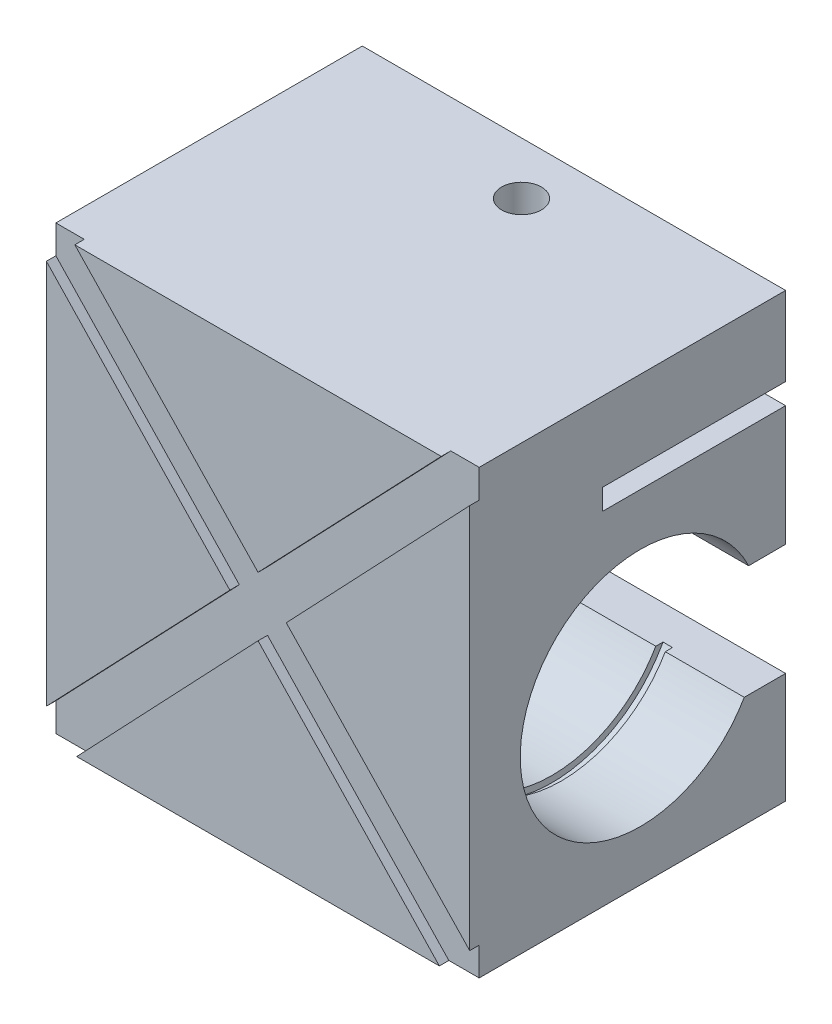
ISO-10303-21;
HEADER;
FILE_DESCRIPTION(('STEP AP214'),'2;1');
FILE_NAME('part.step','',(''),(''),'','','');
FILE_SCHEMA(('AUTOMOTIVE_DESIGN { 1 0 10303 214 1 1 1 1 }'));
ENDSEC;
DATA;
#1=APPLICATION_CONTEXT('core data for automotive mechanical design processes');
#2=APPLICATION_PROTOCOL_DEFINITION('international standard','automotive_design',2000,#1);
#3=PRODUCT_CONTEXT('',#1,'mechanical');
#4=PRODUCT('Part','Part','',(#3));
#5=PRODUCT_RELATED_PRODUCT_CATEGORY('part','',(#4));
#6=PRODUCT_DEFINITION_FORMATION('','',#4);
#7=PRODUCT_DEFINITION_CONTEXT('part definition',#1,'design');
#8=PRODUCT_DEFINITION('design','',#6,#7);
#9=PRODUCT_DEFINITION_SHAPE('','',#8);
#10=(LENGTH_UNIT() NAMED_UNIT(*) SI_UNIT(.MILLI.,.METRE.));
#11=(NAMED_UNIT(*) PLANE_ANGLE_UNIT() SI_UNIT($,.RADIAN.));
#12=(NAMED_UNIT(*) SI_UNIT($,.STERADIAN.) SOLID_ANGLE_UNIT());
#13=UNCERTAINTY_MEASURE_WITH_UNIT(LENGTH_MEASURE(1.E-05),#10,'distance_accuracy_value','');
#14=(GEOMETRIC_REPRESENTATION_CONTEXT(3) GLOBAL_UNCERTAINTY_ASSIGNED_CONTEXT((#13)) GLOBAL_UNIT_ASSIGNED_CONTEXT((#10,
#11,#12)) REPRESENTATION_CONTEXT('',''));
#15=CARTESIAN_POINT('',(0.,0.,0.));
#16=DIRECTION('',(0.,0.,1.));
#17=DIRECTION('',(1.,0.,0.));
#18=AXIS2_PLACEMENT_3D('',#15,#16,#17);
#19=CARTESIAN_POINT('',(-33.5,-17.5000000000001,-50.));
#20=DIRECTION('',(0.,-1.,0.));
#21=DIRECTION('',(1.,0.,0.));
#22=AXIS2_PLACEMENT_3D('',#19,#20,#21);
#23=PLANE('',#22);
#24=DIRECTION('',(0.,0.,1.));
#25=VECTOR('',#24,1.);
#26=CARTESIAN_POINT('',(-24.,-17.5000000000001,-50.));
#27=LINE('',#26,#25);
#28=CARTESIAN_POINT('',(-24.,-17.5000000000001,-44.5997159067981));
#29=VERTEX_POINT('',#28);
#30=CARTESIAN_POINT('',(-24.,-17.5000000000001,-43.4544826719043));
#31=VERTEX_POINT('',#30);
#32=EDGE_CURVE('E286',#29,#31,#27,.T.);
#33=ORIENTED_EDGE('',*,*,#32,.F.);
#34=DIRECTION('',(1.,0.,0.));
#35=VECTOR('',#34,1.);
#36=CARTESIAN_POINT('',(-24.,-17.5000000000001,-44.5997159067981));
#37=LINE('',#36,#35);
#38=CARTESIAN_POINT('',(-22.5,-17.5000000000001,-44.5997159067981));
#39=VERTEX_POINT('',#38);
#40=EDGE_CURVE('E277',#29,#39,#37,.T.);
#41=ORIENTED_EDGE('',*,*,#40,.T.);
#42=DIRECTION('',(0.,0.,1.));
#43=VECTOR('',#42,1.);
#44=CARTESIAN_POINT('',(-22.5,-17.5000000000001,-50.));
#45=LINE('',#44,#43);
#46=CARTESIAN_POINT('',(-22.5,-17.5000000000001,-43.4544826719043));
#47=VERTEX_POINT('',#46);
#48=EDGE_CURVE('E264',#39,#47,#45,.T.);
#49=ORIENTED_EDGE('',*,*,#48,.T.);
#50=DIRECTION('',(1.,0.,0.));
#51=VECTOR('',#50,1.);
#52=CARTESIAN_POINT('',(-33.5,-17.5000000000001,-43.4544826719043));
#53=LINE('',#52,#51);
#54=CARTESIAN_POINT('',(19.5,-17.5,-43.4544826719043));
#55=VERTEX_POINT('',#54);
#56=EDGE_CURVE('E371',#47,#55,#53,.T.);
#57=ORIENTED_EDGE('',*,*,#56,.T.);
#58=DIRECTION('',(0.,0.,1.));
#59=VECTOR('',#58,1.);
#60=CARTESIAN_POINT('',(19.5,-17.4999999999999,-50.));
#61=LINE('',#60,#59);
#62=CARTESIAN_POINT('',(19.5,-17.4999999999999,-44.5997159067981));
#63=VERTEX_POINT('',#62);
#64=EDGE_CURVE('E311',#63,#55,#61,.T.);
#65=ORIENTED_EDGE('',*,*,#64,.F.);
#66=DIRECTION('',(1.,0.,0.));
#67=VECTOR('',#66,1.);
#68=CARTESIAN_POINT('',(19.5,-17.4999999999999,-44.5997159067981));
#69=LINE('',#68,#67);
#70=CARTESIAN_POINT('',(21.,-17.4999999999999,-44.5997159067981));
#71=VERTEX_POINT('',#70);
#72=EDGE_CURVE('E315',#63,#71,#69,.T.);
#73=ORIENTED_EDGE('',*,*,#72,.T.);
#74=DIRECTION('',(0.,0.,1.));
#75=VECTOR('',#74,1.);
#76=CARTESIAN_POINT('',(21.,-17.4999999999999,-50.));
#77=LINE('',#76,#75);
#78=CARTESIAN_POINT('',(21.,-17.5,-43.4544826719043));
#79=VERTEX_POINT('',#78);
#80=EDGE_CURVE('E303',#71,#79,#77,.T.);
#81=ORIENTED_EDGE('',*,*,#80,.T.);
#82=CARTESIAN_POINT('',(33.5,-17.4999999999999,-43.4544826719043));
#83=VERTEX_POINT('',#82);
#84=EDGE_CURVE('E372',#79,#83,#53,.T.);
#85=ORIENTED_EDGE('',*,*,#84,.T.);
#86=DIRECTION('',(0.,0.,-1.));
#87=VECTOR('',#86,1.);
#88=CARTESIAN_POINT('',(33.5,-17.4999999999999,-50.));
#89=LINE('',#88,#87);
#90=CARTESIAN_POINT('',(33.5,-17.4999999999999,-50.));
#91=VERTEX_POINT('',#90);
#92=EDGE_CURVE('E376',#83,#91,#89,.T.);
#93=ORIENTED_EDGE('',*,*,#92,.T.);
#94=DIRECTION('',(1.,0.,0.));
#95=VECTOR('',#94,1.);
#96=CARTESIAN_POINT('',(-33.5,-17.5000000000001,-50.));
#97=LINE('',#96,#95);
#98=CARTESIAN_POINT('',(-33.5,-17.5000000000001,-50.));
#99=VERTEX_POINT('',#98);
#100=EDGE_CURVE('E319',#99,#91,#97,.T.);
#101=ORIENTED_EDGE('',*,*,#100,.F.);
#102=DIRECTION('',(0.,0.,-1.));
#103=VECTOR('',#102,1.);
#104=CARTESIAN_POINT('',(-33.5,-17.5000000000001,-50.));
#105=LINE('',#104,#103);
#106=CARTESIAN_POINT('',(-33.5,-17.5000000000001,-43.4544826719043));
#107=VERTEX_POINT('',#106);
#108=EDGE_CURVE('E361',#107,#99,#105,.T.);
#109=ORIENTED_EDGE('',*,*,#108,.F.);
#110=EDGE_CURVE('E368',#107,#31,#53,.T.);
#111=ORIENTED_EDGE('',*,*,#110,.T.);
#112=EDGE_LOOP('',(#33,#41,#49,#57,#65,#73,#81,#85,#93,#101,#109,#111));
#113=FACE_BOUND('',#112,.T.);
#114=ADVANCED_FACE('F57',(#113),#23,.F.);
#115=CARTESIAN_POINT('',(-33.5000000000001,-8.00000000000011,-27.));
#116=DIRECTION('',(1.,0.,0.));
#117=DIRECTION('',(0.,1.,0.));
#118=AXIS2_PLACEMENT_3D('',#115,#116,#117);
#119=CYLINDRICAL_SURFACE('',#118,19.);
#120=CARTESIAN_POINT('',(-24.0000000000001,-8.00000000000008,-27.));
#121=DIRECTION('',(1.,0.,0.));
#122=DIRECTION('',(0.,1.,0.));
#123=AXIS2_PLACEMENT_3D('',#120,#121,#122);
#124=CIRCLE('',#123,19.);
#125=CARTESIAN_POINT('',(-24.0000000000001,0.17660241080486,-44.1506027012353));
#126=VERTEX_POINT('',#125);
#127=EDGE_CURVE('E272',#31,#126,#124,.F.);
#128=ORIENTED_EDGE('',*,*,#127,.F.);
#129=ORIENTED_EDGE('',*,*,#110,.F.);
#130=CARTESIAN_POINT('',(-33.5000000000001,-8.00000000000011,-27.));
#131=DIRECTION('',(1.,0.,0.));
#132=DIRECTION('',(0.,1.,0.));
#133=AXIS2_PLACEMENT_3D('',#130,#131,#132);
#134=CIRCLE('',#133,19.);
#135=CARTESIAN_POINT('',(-33.5000000000001,0.176602410804828,-44.1506027012353));
#136=VERTEX_POINT('',#135);
#137=EDGE_CURVE('E390',#136,#107,#134,.T.);
#138=ORIENTED_EDGE('',*,*,#137,.F.);
#139=DIRECTION('',(1.,0.,0.));
#140=VECTOR('',#139,1.);
#141=CARTESIAN_POINT('',(-33.5000000000001,0.176602410804828,-44.1506027012353));
#142=LINE('',#141,#140);
#143=EDGE_CURVE('E362',#136,#126,#142,.T.);
#144=ORIENTED_EDGE('',*,*,#143,.T.);
#145=EDGE_LOOP('',(#128,#129,#138,#144));
#146=FACE_BOUND('',#145,.T.);
#147=ADVANCED_FACE('F607',(#146),#119,.F.);
#148=CARTESIAN_POINT('',(-33.5000000000001,0.199999999999886,-50.));
#149=DIRECTION('',(0.,0.999992000095999,0.0039999680003838));
#150=DIRECTION('',(0.,-0.0039999680003838,0.999992000095999));
#151=AXIS2_PLACEMENT_3D('',#148,#149,#150);
#152=PLANE('',#151);
#153=DIRECTION('',(0.,0.0039999680003838,-0.999992000095999));
#154=VECTOR('',#153,1.);
#155=CARTESIAN_POINT('',(-24.0000000000001,0.199999999999918,-50.));
#156=LINE('',#155,#154);
#157=CARTESIAN_POINT('',(-24.0000000000001,0.181000955978129,-45.2502389945525));
#158=VERTEX_POINT('',#157);
#159=EDGE_CURVE('E13',#126,#158,#156,.T.);
#160=ORIENTED_EDGE('',*,*,#159,.F.);
#161=ORIENTED_EDGE('',*,*,#143,.F.);
#162=DIRECTION('',(0.,-0.0039999680003838,0.999992000095999));
#163=VECTOR('',#162,1.);
#164=CARTESIAN_POINT('',(-33.5000000000001,0.199999999999886,-50.));
#165=LINE('',#164,#163);
#166=CARTESIAN_POINT('',(-33.4999999999999,0.199999999999886,-50.));
#167=VERTEX_POINT('',#166);
#168=EDGE_CURVE('E380',#167,#136,#165,.T.);
#169=ORIENTED_EDGE('',*,*,#168,.F.);
#170=DIRECTION('',(1.,0.,0.));
#171=VECTOR('',#170,1.);
#172=CARTESIAN_POINT('',(-33.5000000000001,0.199999999999886,-50.));
#173=LINE('',#172,#171);
#174=CARTESIAN_POINT('',(33.4999999999999,0.200000000000112,-50.));
#175=VERTEX_POINT('',#174);
#176=EDGE_CURVE('E358',#167,#175,#173,.T.);
#177=ORIENTED_EDGE('',*,*,#176,.T.);
#178=DIRECTION('',(0.,-0.0039999680003838,0.999992000095999));
#179=VECTOR('',#178,1.);
#180=CARTESIAN_POINT('',(33.4999999999999,0.200000000000112,-50.));
#181=LINE('',#180,#179);
#182=CARTESIAN_POINT('',(33.4999999999999,0.176602410805054,-44.1506027012353));
#183=VERTEX_POINT('',#182);
#184=EDGE_CURVE('E339',#175,#183,#181,.T.);
#185=ORIENTED_EDGE('',*,*,#184,.T.);
#186=CARTESIAN_POINT('',(20.9999999999999,0.176602410805012,-44.1506027012353));
#187=VERTEX_POINT('',#186);
#188=EDGE_CURVE('E367',#187,#183,#142,.T.);
#189=ORIENTED_EDGE('',*,*,#188,.F.);
#190=DIRECTION('',(0.,0.0039999680003838,-0.999992000095999));
#191=VECTOR('',#190,1.);
#192=CARTESIAN_POINT('',(20.9999999999999,0.20000000000007,-50.));
#193=LINE('',#192,#191);
#194=CARTESIAN_POINT('',(20.9999999999999,0.181000955978282,-45.2502389945525));
#195=VERTEX_POINT('',#194);
#196=EDGE_CURVE('E565',#187,#195,#193,.T.);
#197=ORIENTED_EDGE('',*,*,#196,.T.);
#198=DIRECTION('',(1.,0.,0.));
#199=VECTOR('',#198,1.);
#200=CARTESIAN_POINT('',(19.4999999999999,0.181000955978277,-45.2502389945525));
#201=LINE('',#200,#199);
#202=CARTESIAN_POINT('',(19.4999999999999,0.181000955978277,-45.2502389945525));
#203=VERTEX_POINT('',#202);
#204=EDGE_CURVE('E580',#195,#203,#201,.F.);
#205=ORIENTED_EDGE('',*,*,#204,.T.);
#206=DIRECTION('',(0.,0.0039999680003838,-0.999992000095999));
#207=VECTOR('',#206,1.);
#208=CARTESIAN_POINT('',(19.4999999999999,0.200000000000064,-50.));
#209=LINE('',#208,#207);
#210=CARTESIAN_POINT('',(19.4999999999999,0.176602410805007,-44.1506027012353));
#211=VERTEX_POINT('',#210);
#212=EDGE_CURVE('E584',#211,#203,#209,.T.);
#213=ORIENTED_EDGE('',*,*,#212,.F.);
#214=CARTESIAN_POINT('',(-22.5000000000001,0.176602410804865,-44.1506027012353));
#215=VERTEX_POINT('',#214);
#216=EDGE_CURVE('E366',#215,#211,#142,.T.);
#217=ORIENTED_EDGE('',*,*,#216,.F.);
#218=DIRECTION('',(0.,0.0039999680003838,-0.999992000095999));
#219=VECTOR('',#218,1.);
#220=CARTESIAN_POINT('',(-22.5000000000001,0.199999999999923,-50.));
#221=LINE('',#220,#219);
#222=CARTESIAN_POINT('',(-22.5000000000001,0.181000955978135,-45.2502389945525));
#223=VERTEX_POINT('',#222);
#224=EDGE_CURVE('E587',#215,#223,#221,.T.);
#225=ORIENTED_EDGE('',*,*,#224,.T.);
#226=DIRECTION('',(1.,0.,0.));
#227=VECTOR('',#226,1.);
#228=CARTESIAN_POINT('',(-24.0000000000001,0.181000955978129,-45.2502389945525));
#229=LINE('',#228,#227);
#230=EDGE_CURVE('E66',#223,#158,#229,.F.);
#231=ORIENTED_EDGE('',*,*,#230,.T.);
#232=EDGE_LOOP('',(#160,#161,#169,#177,#185,#189,#197,#205,#213,#217,#225,#231));
#233=FACE_BOUND('',#232,.T.);
#234=ADVANCED_FACE('F592',(#233),#152,.F.);
#235=ORIENTED_EDGE('',*,*,#56,.F.);
#236=CARTESIAN_POINT('',(-22.5000000000001,-8.00000000000008,-27.));
#237=DIRECTION('',(1.,0.,0.));
#238=DIRECTION('',(0.,1.,0.));
#239=AXIS2_PLACEMENT_3D('',#236,#237,#238);
#240=CIRCLE('',#239,19.);
#241=EDGE_CURVE('E267',#47,#215,#240,.F.);
#242=ORIENTED_EDGE('',*,*,#241,.T.);
#243=ORIENTED_EDGE('',*,*,#216,.T.);
#244=CARTESIAN_POINT('',(19.4999999999999,-7.99999999999993,-27.));
#245=DIRECTION('',(1.,0.,0.));
#246=DIRECTION('',(0.,1.,0.));
#247=AXIS2_PLACEMENT_3D('',#244,#245,#246);
#248=CIRCLE('',#247,19.);
#249=EDGE_CURVE('E307',#55,#211,#248,.F.);
#250=ORIENTED_EDGE('',*,*,#249,.F.);
#251=EDGE_LOOP('',(#235,#242,#243,#250));
#252=FACE_BOUND('',#251,.T.);
#253=ADVANCED_FACE('F596',(#252),#119,.F.);
#254=CARTESIAN_POINT('',(0.,0.,-50.));
#255=DIRECTION('',(0.,0.,1.));
#256=DIRECTION('',(1.,0.,0.));
#257=AXIS2_PLACEMENT_3D('',#254,#255,#256);
#258=PLANE('',#257);
#259=DIRECTION('',(0.,1.,0.));
#260=VECTOR('',#259,1.);
#261=CARTESIAN_POINT('',(33.4999999999999,1.12905716522147E-13,-50.));
#262=LINE('',#261,#260);
#263=CARTESIAN_POINT('',(33.4999999999998,22.5000000000001,-50.));
#264=VERTEX_POINT('',#263);
#265=CARTESIAN_POINT('',(33.4999999999998,35.0000000000002,-50.));
#266=VERTEX_POINT('',#265);
#267=EDGE_CURVE('E529',#264,#266,#262,.T.);
#268=ORIENTED_EDGE('',*,*,#267,.F.);
#269=DIRECTION('',(1.,0.,0.));
#270=VECTOR('',#269,1.);
#271=CARTESIAN_POINT('',(-33.5000000000002,22.4999999999999,-50.));
#272=LINE('',#271,#270);
#273=CARTESIAN_POINT('',(-33.5000000000002,22.4999999999999,-50.));
#274=VERTEX_POINT('',#273);
#275=EDGE_CURVE('E349',#274,#264,#272,.T.);
#276=ORIENTED_EDGE('',*,*,#275,.F.);
#277=DIRECTION('',(0.,1.,0.));
#278=VECTOR('',#277,1.);
#279=CARTESIAN_POINT('',(-33.4999999999999,0.,-50.));
#280=LINE('',#279,#278);
#281=CARTESIAN_POINT('',(-33.5,35.,-50.));
#282=VERTEX_POINT('',#281);
#283=EDGE_CURVE('E540',#274,#282,#280,.T.);
#284=ORIENTED_EDGE('',*,*,#283,.T.);
#285=DIRECTION('',(-1.,0.,0.));
#286=VECTOR('',#285,1.);
#287=CARTESIAN_POINT('',(-1.19618245656909E-13,35.0000000000001,-50.));
#288=LINE('',#287,#286);
#289=EDGE_CURVE('E535',#266,#282,#288,.T.);
#290=ORIENTED_EDGE('',*,*,#289,.F.);
#291=EDGE_LOOP('',(#268,#276,#284,#290));
#292=FACE_BOUND('',#291,.T.);
#293=ADVANCED_FACE('F639',(#292),#258,.F.);
#294=CARTESIAN_POINT('',(-33.4999999999998,-35.0000000000002,-50.));
#295=VERTEX_POINT('',#294);
#296=EDGE_CURVE('E541',#295,#99,#280,.T.);
#297=ORIENTED_EDGE('',*,*,#296,.T.);
#298=ORIENTED_EDGE('',*,*,#100,.T.);
#299=CARTESIAN_POINT('',(33.5,-35.,-50.));
#300=VERTEX_POINT('',#299);
#301=EDGE_CURVE('E531',#300,#91,#262,.T.);
#302=ORIENTED_EDGE('',*,*,#301,.F.);
#303=DIRECTION('',(-1.,0.,0.));
#304=VECTOR('',#303,1.);
#305=CARTESIAN_POINT('',(1.01494269042226E-13,-35.0000000000001,-50.));
#306=LINE('',#305,#304);
#307=EDGE_CURVE('E525',#300,#295,#306,.T.);
#308=ORIENTED_EDGE('',*,*,#307,.T.);
#309=EDGE_LOOP('',(#297,#298,#302,#308));
#310=FACE_BOUND('',#309,.T.);
#311=ADVANCED_FACE('F662',(#310),#258,.F.);
#312=CARTESIAN_POINT('',(1.01494269042226E-13,-35.0000000000001,-50.));
#313=DIRECTION('',(0.,1.,0.));
#314=DIRECTION('',(-1.,0.,0.));
#315=AXIS2_PLACEMENT_3D('',#312,#313,#314);
#316=PLANE('',#315);
#317=DIRECTION('',(0.,0.,1.));
#318=VECTOR('',#317,1.);
#319=CARTESIAN_POINT('',(-28.7000000000002,-35.0000000000002,-1.5));
#320=LINE('',#319,#318);
#321=CARTESIAN_POINT('',(-28.7000000000002,-35.0000000000002,-1.5));
#322=VERTEX_POINT('',#321);
#323=CARTESIAN_POINT('',(-28.7000000000002,-35.0000000000002,0.));
#324=VERTEX_POINT('',#323);
#325=EDGE_CURVE('E476',#322,#324,#320,.T.);
#326=ORIENTED_EDGE('',*,*,#325,.F.);
#327=DIRECTION('',(-1.,0.,0.));
#328=VECTOR('',#327,1.);
#329=CARTESIAN_POINT('',(1.01494269042226E-13,-35.0000000000001,-1.5));
#330=LINE('',#329,#328);
#331=CARTESIAN_POINT('',(-33.4999999999998,-35.0000000000002,-1.5));
#332=VERTEX_POINT('',#331);
#333=EDGE_CURVE('E411',#322,#332,#330,.T.);
#334=ORIENTED_EDGE('',*,*,#333,.T.);
#335=DIRECTION('',(0.,0.,1.));
#336=VECTOR('',#335,1.);
#337=CARTESIAN_POINT('',(-33.4999999999998,-35.0000000000002,-50.));
#338=LINE('',#337,#336);
#339=EDGE_CURVE('E561',#295,#332,#338,.T.);
#340=ORIENTED_EDGE('',*,*,#339,.F.);
#341=ORIENTED_EDGE('',*,*,#307,.F.);
#342=DIRECTION('',(0.,0.,1.));
#343=VECTOR('',#342,1.);
#344=CARTESIAN_POINT('',(33.5,-35.,-50.));
#345=LINE('',#344,#343);
#346=CARTESIAN_POINT('',(33.5,-35.,-1.5));
#347=VERTEX_POINT('',#346);
#348=EDGE_CURVE('E545',#300,#347,#345,.T.);
#349=ORIENTED_EDGE('',*,*,#348,.T.);
#350=CARTESIAN_POINT('',(28.7,-35.,-1.5));
#351=VERTEX_POINT('',#350);
#352=EDGE_CURVE('E406',#347,#351,#330,.T.);
#353=ORIENTED_EDGE('',*,*,#352,.T.);
#354=DIRECTION('',(0.,0.,1.));
#355=VECTOR('',#354,1.);
#356=CARTESIAN_POINT('',(28.7,-35.,-1.5));
#357=LINE('',#356,#355);
#358=CARTESIAN_POINT('',(28.7,-35.,0.));
#359=VERTEX_POINT('',#358);
#360=EDGE_CURVE('E510',#351,#359,#357,.T.);
#361=ORIENTED_EDGE('',*,*,#360,.T.);
#362=DIRECTION('',(-1.,0.,0.));
#363=VECTOR('',#362,1.);
#364=CARTESIAN_POINT('',(1.01494269042226E-13,-35.0000000000001,0.));
#365=LINE('',#364,#363);
#366=EDGE_CURVE('E524',#359,#324,#365,.T.);
#367=ORIENTED_EDGE('',*,*,#366,.T.);
#368=EDGE_LOOP('',(#326,#334,#340,#341,#349,#353,#361,#367));
#369=FACE_BOUND('',#368,.T.);
#370=ADVANCED_FACE('F59',(#369),#316,.F.);
#371=CARTESIAN_POINT('',(-33.4999999999999,0.,-50.));
#372=DIRECTION('',(1.,0.,0.));
#373=DIRECTION('',(0.,1.,0.));
#374=AXIS2_PLACEMENT_3D('',#371,#372,#373);
#375=PLANE('',#374);
#376=ORIENTED_EDGE('',*,*,#283,.F.);
#377=DIRECTION('',(0.,0.,1.));
#378=VECTOR('',#377,1.);
#379=CARTESIAN_POINT('',(-33.5000000000002,22.4999999999999,-21.));
#380=LINE('',#379,#378);
#381=CARTESIAN_POINT('',(-33.5000000000002,22.4999999999999,-21.));
#382=VERTEX_POINT('',#381);
#383=EDGE_CURVE('E329',#274,#382,#380,.T.);
#384=ORIENTED_EDGE('',*,*,#383,.T.);
#385=DIRECTION('',(0.,-1.,0.));
#386=VECTOR('',#385,1.);
#387=CARTESIAN_POINT('',(-33.5000000000002,22.4999999999999,-21.));
#388=LINE('',#387,#386);
#389=CARTESIAN_POINT('',(-33.5000000000002,19.1999999999999,-21.));
#390=VERTEX_POINT('',#389);
#391=EDGE_CURVE('E320',#382,#390,#388,.T.);
#392=ORIENTED_EDGE('',*,*,#391,.T.);
#393=DIRECTION('',(0.,0.,-1.));
#394=VECTOR('',#393,1.);
#395=CARTESIAN_POINT('',(-33.5000000000002,19.1999999999999,-21.));
#396=LINE('',#395,#394);
#397=CARTESIAN_POINT('',(-33.5000000000002,19.1999999999999,-50.));
#398=VERTEX_POINT('',#397);
#399=EDGE_CURVE('E324',#390,#398,#396,.T.);
#400=ORIENTED_EDGE('',*,*,#399,.T.);
#401=EDGE_CURVE('E546',#167,#398,#280,.T.);
#402=ORIENTED_EDGE('',*,*,#401,.F.);
#403=ORIENTED_EDGE('',*,*,#168,.T.);
#404=ORIENTED_EDGE('',*,*,#137,.T.);
#405=ORIENTED_EDGE('',*,*,#108,.T.);
#406=ORIENTED_EDGE('',*,*,#296,.F.);
#407=ORIENTED_EDGE('',*,*,#339,.T.);
#408=DIRECTION('',(0.,1.,0.));
#409=VECTOR('',#408,1.);
#410=CARTESIAN_POINT('',(-33.4999999999999,0.,-1.5));
#411=LINE('',#410,#409);
#412=CARTESIAN_POINT('',(-33.5,-30.5,-1.5));
#413=VERTEX_POINT('',#412);
#414=EDGE_CURVE('E440',#332,#413,#411,.T.);
#415=ORIENTED_EDGE('',*,*,#414,.T.);
#416=DIRECTION('',(0.,0.,1.));
#417=VECTOR('',#416,1.);
#418=CARTESIAN_POINT('',(-33.5,-30.5,-1.5));
#419=LINE('',#418,#417);
#420=CARTESIAN_POINT('',(-33.5,-30.5,0.));
#421=VERTEX_POINT('',#420);
#422=EDGE_CURVE('E480',#413,#421,#419,.T.);
#423=ORIENTED_EDGE('',*,*,#422,.T.);
#424=DIRECTION('',(0.,1.,0.));
#425=VECTOR('',#424,1.);
#426=CARTESIAN_POINT('',(-33.4999999999999,0.,0.));
#427=LINE('',#426,#425);
#428=CARTESIAN_POINT('',(-33.5,30.5,0.));
#429=VERTEX_POINT('',#428);
#430=EDGE_CURVE('E530',#421,#429,#427,.T.);
#431=ORIENTED_EDGE('',*,*,#430,.T.);
#432=DIRECTION('',(0.,0.,1.));
#433=VECTOR('',#432,1.);
#434=CARTESIAN_POINT('',(-33.5,30.5,-1.5));
#435=LINE('',#434,#433);
#436=CARTESIAN_POINT('',(-33.5,30.5,-1.5));
#437=VERTEX_POINT('',#436);
#438=EDGE_CURVE('E487',#437,#429,#435,.T.);
#439=ORIENTED_EDGE('',*,*,#438,.F.);
#440=CARTESIAN_POINT('',(-33.5,35.,-1.5));
#441=VERTEX_POINT('',#440);
#442=EDGE_CURVE('E435',#437,#441,#411,.T.);
#443=ORIENTED_EDGE('',*,*,#442,.T.);
#444=DIRECTION('',(0.,0.,1.));
#445=VECTOR('',#444,1.);
#446=CARTESIAN_POINT('',(-33.5,35.,-50.));
#447=LINE('',#446,#445);
#448=EDGE_CURVE('E566',#282,#441,#447,.T.);
#449=ORIENTED_EDGE('',*,*,#448,.F.);
#450=EDGE_LOOP('',(#376,#384,#392,#400,#402,#403,#404,#405,#406,#407,#415,#423,#431,#439,#443,#449));
#451=FACE_BOUND('',#450,.T.);
#452=ADVANCED_FACE('F612',(#451),#375,.F.);
#453=CARTESIAN_POINT('',(-1.19618245656909E-13,35.0000000000001,-50.));
#454=DIRECTION('',(0.,1.,0.));
#455=DIRECTION('',(-1.,0.,0.));
#456=AXIS2_PLACEMENT_3D('',#453,#454,#455);
#457=PLANE('',#456);
#458=DIRECTION('',(0.,0.,1.));
#459=VECTOR('',#458,1.);
#460=CARTESIAN_POINT('',(-29.,35.,-1.5));
#461=LINE('',#460,#459);
#462=CARTESIAN_POINT('',(-29.,35.,-1.5));
#463=VERTEX_POINT('',#462);
#464=CARTESIAN_POINT('',(-29.,35.,0.));
#465=VERTEX_POINT('',#464);
#466=EDGE_CURVE('E490',#463,#465,#461,.T.);
#467=ORIENTED_EDGE('',*,*,#466,.T.);
#468=DIRECTION('',(-1.,0.,0.));
#469=VECTOR('',#468,1.);
#470=CARTESIAN_POINT('',(-1.19618245656909E-13,35.0000000000001,0.));
#471=LINE('',#470,#469);
#472=CARTESIAN_POINT('',(29.0000000000002,35.0000000000002,0.));
#473=VERTEX_POINT('',#472);
#474=EDGE_CURVE('E554',#473,#465,#471,.T.);
#475=ORIENTED_EDGE('',*,*,#474,.F.);
#476=DIRECTION('',(0.,0.,1.));
#477=VECTOR('',#476,1.);
#478=CARTESIAN_POINT('',(29.0000000000002,35.0000000000002,-1.5));
#479=LINE('',#478,#477);
#480=CARTESIAN_POINT('',(29.0000000000002,35.0000000000002,-1.5));
#481=VERTEX_POINT('',#480);
#482=EDGE_CURVE('E497',#481,#473,#479,.T.);
#483=ORIENTED_EDGE('',*,*,#482,.F.);
#484=DIRECTION('',(-1.,0.,0.));
#485=VECTOR('',#484,1.);
#486=CARTESIAN_POINT('',(-1.19618245656909E-13,35.0000000000001,-1.5));
#487=LINE('',#486,#485);
#488=CARTESIAN_POINT('',(33.4999999999998,35.0000000000002,-1.5));
#489=VERTEX_POINT('',#488);
#490=EDGE_CURVE('E423',#489,#481,#487,.T.);
#491=ORIENTED_EDGE('',*,*,#490,.F.);
#492=DIRECTION('',(0.,0.,1.));
#493=VECTOR('',#492,1.);
#494=CARTESIAN_POINT('',(33.4999999999998,35.0000000000002,-50.));
#495=LINE('',#494,#493);
#496=EDGE_CURVE('E570',#266,#489,#495,.T.);
#497=ORIENTED_EDGE('',*,*,#496,.F.);
#498=ORIENTED_EDGE('',*,*,#289,.T.);
#499=ORIENTED_EDGE('',*,*,#448,.T.);
#500=EDGE_CURVE('E428',#463,#441,#487,.T.);
#501=ORIENTED_EDGE('',*,*,#500,.F.);
#502=EDGE_LOOP('',(#467,#475,#483,#491,#497,#498,#499,#501));
#503=FACE_BOUND('',#502,.T.);
#504=CARTESIAN_POINT('',(-1.19618245656909E-13,35.0000000000001,-41.7));
#505=DIRECTION('',(0.,1.,0.));
#506=DIRECTION('',(-1.,0.,0.));
#507=AXIS2_PLACEMENT_3D('',#504,#505,#506);
#508=CIRCLE('',#507,3.15);
#509=CARTESIAN_POINT('',(-3.15000000000012,35.0000000000001,-41.7));
#510=VERTEX_POINT('',#509);
#511=EDGE_CURVE('E479',#510,#510,#508,.T.);
#512=ORIENTED_EDGE('',*,*,#511,.F.);
#513=EDGE_LOOP('',(#512));
#514=FACE_BOUND('',#513,.T.);
#515=ADVANCED_FACE('F636',(#503,#514),#457,.T.);
#516=CARTESIAN_POINT('',(33.4999999999999,1.12905716522147E-13,-50.));
#517=DIRECTION('',(1.,0.,0.));
#518=DIRECTION('',(0.,1.,0.));
#519=AXIS2_PLACEMENT_3D('',#516,#517,#518);
#520=PLANE('',#519);
#521=DIRECTION('',(0.,0.,1.));
#522=VECTOR('',#521,1.);
#523=CARTESIAN_POINT('',(33.4999999999998,22.5000000000001,-21.));
#524=LINE('',#523,#522);
#525=CARTESIAN_POINT('',(33.4999999999998,22.5000000000001,-21.));
#526=VERTEX_POINT('',#525);
#527=EDGE_CURVE('E325',#264,#526,#524,.T.);
#528=ORIENTED_EDGE('',*,*,#527,.F.);
#529=ORIENTED_EDGE('',*,*,#267,.T.);
#530=ORIENTED_EDGE('',*,*,#496,.T.);
#531=DIRECTION('',(0.,1.,0.));
#532=VECTOR('',#531,1.);
#533=CARTESIAN_POINT('',(33.4999999999999,1.12905716522147E-13,-1.5));
#534=LINE('',#533,#532);
#535=CARTESIAN_POINT('',(33.4999999999998,30.4999999999998,-1.5));
#536=VERTEX_POINT('',#535);
#537=EDGE_CURVE('E416',#536,#489,#534,.T.);
#538=ORIENTED_EDGE('',*,*,#537,.F.);
#539=DIRECTION('',(0.,0.,1.));
#540=VECTOR('',#539,1.);
#541=CARTESIAN_POINT('',(33.4999999999998,30.4999999999998,-1.5));
#542=LINE('',#541,#540);
#543=CARTESIAN_POINT('',(33.4999999999998,30.4999999999998,0.));
#544=VERTEX_POINT('',#543);
#545=EDGE_CURVE('E500',#536,#544,#542,.T.);
#546=ORIENTED_EDGE('',*,*,#545,.T.);
#547=DIRECTION('',(0.,1.,0.));
#548=VECTOR('',#547,1.);
#549=CARTESIAN_POINT('',(33.4999999999999,1.12905716522147E-13,0.));
#550=LINE('',#549,#548);
#551=CARTESIAN_POINT('',(33.5,-30.5,0.));
#552=VERTEX_POINT('',#551);
#553=EDGE_CURVE('E550',#552,#544,#550,.T.);
#554=ORIENTED_EDGE('',*,*,#553,.F.);
#555=DIRECTION('',(0.,0.,1.));
#556=VECTOR('',#555,1.);
#557=CARTESIAN_POINT('',(33.5,-30.5,-1.5));
#558=LINE('',#557,#556);
#559=CARTESIAN_POINT('',(33.5,-30.5,-1.5));
#560=VERTEX_POINT('',#559);
#561=EDGE_CURVE('E507',#560,#552,#558,.T.);
#562=ORIENTED_EDGE('',*,*,#561,.F.);
#563=EDGE_CURVE('E410',#347,#560,#534,.T.);
#564=ORIENTED_EDGE('',*,*,#563,.F.);
#565=ORIENTED_EDGE('',*,*,#348,.F.);
#566=ORIENTED_EDGE('',*,*,#301,.T.);
#567=ORIENTED_EDGE('',*,*,#92,.F.);
#568=CARTESIAN_POINT('',(33.4999999999999,-7.99999999999989,-27.));
#569=DIRECTION('',(1.,0.,0.));
#570=DIRECTION('',(0.,1.,0.));
#571=AXIS2_PLACEMENT_3D('',#568,#569,#570);
#572=CIRCLE('',#571,19.);
#573=EDGE_CURVE('E379',#183,#83,#572,.T.);
#574=ORIENTED_EDGE('',*,*,#573,.F.);
#575=ORIENTED_EDGE('',*,*,#184,.F.);
#576=CARTESIAN_POINT('',(33.4999999999998,19.2000000000001,-50.));
#577=VERTEX_POINT('',#576);
#578=EDGE_CURVE('E536',#175,#577,#262,.T.);
#579=ORIENTED_EDGE('',*,*,#578,.T.);
#580=DIRECTION('',(0.,0.,-1.));
#581=VECTOR('',#580,1.);
#582=CARTESIAN_POINT('',(33.4999999999998,19.2000000000001,-21.));
#583=LINE('',#582,#581);
#584=CARTESIAN_POINT('',(33.4999999999998,19.2000000000001,-21.));
#585=VERTEX_POINT('',#584);
#586=EDGE_CURVE('E338',#585,#577,#583,.T.);
#587=ORIENTED_EDGE('',*,*,#586,.F.);
#588=DIRECTION('',(0.,-1.,0.));
#589=VECTOR('',#588,1.);
#590=CARTESIAN_POINT('',(33.4999999999998,22.5000000000001,-21.));
#591=LINE('',#590,#589);
#592=EDGE_CURVE('E334',#526,#585,#591,.T.);
#593=ORIENTED_EDGE('',*,*,#592,.F.);
#594=EDGE_LOOP('',(#528,#529,#530,#538,#546,#554,#562,#564,#565,#566,#567,#574,#575,#579,#587,#593));
#595=FACE_BOUND('',#594,.T.);
#596=ADVANCED_FACE('F628',(#595),#520,.T.);
#597=CARTESIAN_POINT('',(0.,0.,0.));
#598=DIRECTION('',(0.,0.,1.));
#599=DIRECTION('',(1.,0.,0.));
#600=AXIS2_PLACEMENT_3D('',#597,#598,#599);
#601=PLANE('',#600);
#602=ORIENTED_EDGE('',*,*,#430,.F.);
#603=DIRECTION('',(0.690344383286287,0.723480913684028,0.));
#604=VECTOR('',#603,1.);
#605=CARTESIAN_POINT('',(-2.30147013969377,2.19605929360092,0.));
#606=LINE('',#605,#604);
#607=CARTESIAN_POINT('',(-4.46696193000607,-0.0733761026463654,0.));
#608=VERTEX_POINT('',#607);
#609=EDGE_CURVE('E402',#421,#608,#606,.T.);
#610=ORIENTED_EDGE('',*,*,#609,.T.);
#611=DIRECTION('',(0.688603971000375,-0.725137622194929,0.));
#612=VECTOR('',#611,1.);
#613=CARTESIAN_POINT('',(-2.38547742456574,-2.26529306577082,0.));
#614=LINE('',#613,#612);
#615=EDGE_CURVE('E469',#429,#608,#614,.T.);
#616=ORIENTED_EDGE('',*,*,#615,.F.);
#617=EDGE_LOOP('',(#602,#610,#616));
#618=FACE_BOUND('',#617,.T.);
#619=ADVANCED_FACE('F736',(#618),#601,.T.);
#620=ORIENTED_EDGE('',*,*,#553,.T.);
#621=DIRECTION('',(-0.688603971000375,-0.725137622194928,0.));
#622=VECTOR('',#621,1.);
#623=CARTESIAN_POINT('',(2.38547742456573,-2.26529306577082,0.));
#624=LINE('',#623,#622);
#625=CARTESIAN_POINT('',(4.46696193000606,-0.0733761026463589,0.));
#626=VERTEX_POINT('',#625);
#627=EDGE_CURVE('E458',#544,#626,#624,.T.);
#628=ORIENTED_EDGE('',*,*,#627,.T.);
#629=DIRECTION('',(-0.690344383286286,0.723480913684029,0.));
#630=VECTOR('',#629,1.);
#631=CARTESIAN_POINT('',(2.30147013969377,2.19605929360093,0.));
#632=LINE('',#631,#630);
#633=EDGE_CURVE('E454',#552,#626,#632,.T.);
#634=ORIENTED_EDGE('',*,*,#633,.F.);
#635=EDGE_LOOP('',(#620,#628,#634));
#636=FACE_BOUND('',#635,.T.);
#637=ADVANCED_FACE('F689',(#636),#601,.T.);
#638=DIRECTION('',(0.688603971000375,-0.725137622194929,0.));
#639=VECTOR('',#638,1.);
#640=CARTESIAN_POINT('',(-2.38547742456573,-2.26529306577082,0.));
#641=LINE('',#640,#639);
#642=CARTESIAN_POINT('',(0.,-4.77733118971063,0.));
#643=VERTEX_POINT('',#642);
#644=EDGE_CURVE('E451',#643,#359,#641,.T.);
#645=ORIENTED_EDGE('',*,*,#644,.F.);
#646=DIRECTION('',(-0.688603971000375,-0.725137622194928,0.));
#647=VECTOR('',#646,1.);
#648=CARTESIAN_POINT('',(2.38547742456574,-2.26529306577083,0.));
#649=LINE('',#648,#647);
#650=EDGE_CURVE('E447',#643,#324,#649,.T.);
#651=ORIENTED_EDGE('',*,*,#650,.T.);
#652=ORIENTED_EDGE('',*,*,#366,.F.);
#653=EDGE_LOOP('',(#645,#651,#652));
#654=FACE_BOUND('',#653,.T.);
#655=ADVANCED_FACE('F681',(#654),#601,.T.);
#656=ORIENTED_EDGE('',*,*,#401,.T.);
#657=DIRECTION('',(1.,0.,0.));
#658=VECTOR('',#657,1.);
#659=CARTESIAN_POINT('',(-33.5000000000002,19.1999999999999,-50.));
#660=LINE('',#659,#658);
#661=EDGE_CURVE('E352',#398,#577,#660,.T.);
#662=ORIENTED_EDGE('',*,*,#661,.T.);
#663=ORIENTED_EDGE('',*,*,#578,.F.);
#664=ORIENTED_EDGE('',*,*,#176,.F.);
#665=EDGE_LOOP('',(#656,#662,#663,#664));
#666=FACE_BOUND('',#665,.T.);
#667=ADVANCED_FACE('F619',(#666),#258,.F.);
#668=DIRECTION('',(-0.690344383286287,0.723480913684028,0.));
#669=VECTOR('',#668,1.);
#670=CARTESIAN_POINT('',(2.30147013969377,2.19605929360093,0.));
#671=LINE('',#670,#669);
#672=CARTESIAN_POINT('',(0.,4.60799999999999,0.));
#673=VERTEX_POINT('',#672);
#674=EDGE_CURVE('E466',#673,#465,#671,.T.);
#675=ORIENTED_EDGE('',*,*,#674,.F.);
#676=DIRECTION('',(0.690344383286287,0.723480913684028,0.));
#677=VECTOR('',#676,1.);
#678=CARTESIAN_POINT('',(-2.30147013969377,2.19605929360092,0.));
#679=LINE('',#678,#677);
#680=EDGE_CURVE('E462',#673,#473,#679,.T.);
#681=ORIENTED_EDGE('',*,*,#680,.T.);
#682=ORIENTED_EDGE('',*,*,#474,.T.);
#683=EDGE_LOOP('',(#675,#681,#682));
#684=FACE_BOUND('',#683,.T.);
#685=ADVANCED_FACE('F700',(#684),#601,.T.);
#686=CARTESIAN_POINT('',(0.,22.5000000000001,-41.7));
#687=DIRECTION('',(0.,1.,0.));
#688=DIRECTION('',(-1.,0.,0.));
#689=AXIS2_PLACEMENT_3D('',#686,#687,#688);
#690=CYLINDRICAL_SURFACE('',#689,3.15);
#691=CARTESIAN_POINT('',(0.,22.5000000000001,-41.7));
#692=DIRECTION('',(0.,1.,0.));
#693=DIRECTION('',(-1.,0.,0.));
#694=AXIS2_PLACEMENT_3D('',#691,#692,#693);
#695=CIRCLE('',#694,3.15);
#696=CARTESIAN_POINT('',(-3.15000000000008,22.5000000000001,-41.7));
#697=VERTEX_POINT('',#696);
#698=EDGE_CURVE('E348',#697,#697,#695,.T.);
#699=ORIENTED_EDGE('',*,*,#698,.F.);
#700=EDGE_LOOP('',(#699));
#701=FACE_BOUND('',#700,.T.);
#702=ORIENTED_EDGE('',*,*,#511,.T.);
#703=EDGE_LOOP('',(#702));
#704=FACE_BOUND('',#703,.T.);
#705=ADVANCED_FACE('F730',(#701,#704),#690,.F.);
#706=CARTESIAN_POINT('',(2.38547742456574,-2.26529306577083,-1.5));
#707=DIRECTION('',(-0.725137622194928,0.688603971000375,0.));
#708=DIRECTION('',(-0.688603971000375,-0.725137622194928,0.));
#709=AXIS2_PLACEMENT_3D('',#706,#707,#708);
#710=PLANE('',#709);
#711=ORIENTED_EDGE('',*,*,#650,.F.);
#712=DIRECTION('',(0.,0.,1.));
#713=VECTOR('',#712,1.);
#714=CARTESIAN_POINT('',(0.,-4.77733118971063,-1.5));
#715=LINE('',#714,#713);
#716=CARTESIAN_POINT('',(0.,-4.77733118971063,-1.5));
#717=VERTEX_POINT('',#716);
#718=EDGE_CURVE('E514',#717,#643,#715,.T.);
#719=ORIENTED_EDGE('',*,*,#718,.F.);
#720=DIRECTION('',(-0.688603971000375,-0.725137622194928,0.));
#721=VECTOR('',#720,1.);
#722=CARTESIAN_POINT('',(2.38547742456574,-2.26529306577083,-1.5));
#723=LINE('',#722,#721);
#724=EDGE_CURVE('E397',#717,#322,#723,.T.);
#725=ORIENTED_EDGE('',*,*,#724,.T.);
#726=ORIENTED_EDGE('',*,*,#325,.T.);
#727=EDGE_LOOP('',(#711,#719,#725,#726));
#728=FACE_BOUND('',#727,.T.);
#729=ADVANCED_FACE('F675',(#728),#710,.T.);
#730=CARTESIAN_POINT('',(-2.30147013969377,2.19605929360092,-1.5));
#731=DIRECTION('',(0.723480913684029,-0.690344383286287,0.));
#732=DIRECTION('',(0.690344383286287,0.723480913684029,0.));
#733=AXIS2_PLACEMENT_3D('',#730,#731,#732);
#734=PLANE('',#733);
#735=ORIENTED_EDGE('',*,*,#609,.F.);
#736=ORIENTED_EDGE('',*,*,#422,.F.);
#737=DIRECTION('',(0.690344383286287,0.723480913684028,0.));
#738=VECTOR('',#737,1.);
#739=CARTESIAN_POINT('',(-2.30147013969377,2.19605929360092,-1.5));
#740=LINE('',#739,#738);
#741=CARTESIAN_POINT('',(-4.46696193000607,-0.0733761026463654,-1.5));
#742=VERTEX_POINT('',#741);
#743=EDGE_CURVE('E444',#413,#742,#740,.T.);
#744=ORIENTED_EDGE('',*,*,#743,.T.);
#745=DIRECTION('',(0.,0.,1.));
#746=VECTOR('',#745,1.);
#747=CARTESIAN_POINT('',(-4.46696193000607,-0.0733761026463654,-1.5));
#748=LINE('',#747,#746);
#749=EDGE_CURVE('E484',#742,#608,#748,.T.);
#750=ORIENTED_EDGE('',*,*,#749,.T.);
#751=EDGE_LOOP('',(#735,#736,#744,#750));
#752=FACE_BOUND('',#751,.T.);
#753=ADVANCED_FACE('F711',(#752),#734,.T.);
#754=CARTESIAN_POINT('',(-2.38547742456574,-2.26529306577082,-1.5));
#755=DIRECTION('',(-0.725137622194928,-0.688603971000375,0.));
#756=DIRECTION('',(0.688603971000375,-0.725137622194929,0.));
#757=AXIS2_PLACEMENT_3D('',#754,#755,#756);
#758=PLANE('',#757);
#759=ORIENTED_EDGE('',*,*,#615,.T.);
#760=ORIENTED_EDGE('',*,*,#749,.F.);
#761=DIRECTION('',(0.688603971000375,-0.725137622194929,0.));
#762=VECTOR('',#761,1.);
#763=CARTESIAN_POINT('',(-2.38547742456574,-2.26529306577082,-1.5));
#764=LINE('',#763,#762);
#765=EDGE_CURVE('E439',#437,#742,#764,.T.);
#766=ORIENTED_EDGE('',*,*,#765,.F.);
#767=ORIENTED_EDGE('',*,*,#438,.T.);
#768=EDGE_LOOP('',(#759,#760,#766,#767));
#769=FACE_BOUND('',#768,.T.);
#770=ADVANCED_FACE('F704',(#769),#758,.F.);
#771=CARTESIAN_POINT('',(2.30147013969377,2.19605929360093,-1.5));
#772=DIRECTION('',(0.723480913684028,0.690344383286287,0.));
#773=DIRECTION('',(-0.690344383286287,0.723480913684028,0.));
#774=AXIS2_PLACEMENT_3D('',#771,#772,#773);
#775=PLANE('',#774);
#776=ORIENTED_EDGE('',*,*,#674,.T.);
#777=ORIENTED_EDGE('',*,*,#466,.F.);
#778=DIRECTION('',(-0.690344383286287,0.723480913684028,0.));
#779=VECTOR('',#778,1.);
#780=CARTESIAN_POINT('',(2.30147013969377,2.19605929360093,-1.5));
#781=LINE('',#780,#779);
#782=CARTESIAN_POINT('',(0.,4.60799999999999,-1.5));
#783=VERTEX_POINT('',#782);
#784=EDGE_CURVE('E431',#783,#463,#781,.T.);
#785=ORIENTED_EDGE('',*,*,#784,.F.);
#786=DIRECTION('',(0.,0.,1.));
#787=VECTOR('',#786,1.);
#788=CARTESIAN_POINT('',(0.,4.60799999999999,-1.5));
#789=LINE('',#788,#787);
#790=EDGE_CURVE('E494',#783,#673,#789,.T.);
#791=ORIENTED_EDGE('',*,*,#790,.T.);
#792=EDGE_LOOP('',(#776,#777,#785,#791));
#793=FACE_BOUND('',#792,.T.);
#794=ADVANCED_FACE('F702',(#793),#775,.F.);
#795=CARTESIAN_POINT('',(-2.30147013969377,2.19605929360092,-1.5));
#796=DIRECTION('',(0.723480913684029,-0.690344383286287,0.));
#797=DIRECTION('',(0.690344383286287,0.723480913684029,0.));
#798=AXIS2_PLACEMENT_3D('',#795,#796,#797);
#799=PLANE('',#798);
#800=ORIENTED_EDGE('',*,*,#680,.F.);
#801=ORIENTED_EDGE('',*,*,#790,.F.);
#802=DIRECTION('',(0.690344383286287,0.723480913684028,0.));
#803=VECTOR('',#802,1.);
#804=CARTESIAN_POINT('',(-2.30147013969377,2.19605929360092,-1.5));
#805=LINE('',#804,#803);
#806=EDGE_CURVE('E427',#783,#481,#805,.T.);
#807=ORIENTED_EDGE('',*,*,#806,.T.);
#808=ORIENTED_EDGE('',*,*,#482,.T.);
#809=EDGE_LOOP('',(#800,#801,#807,#808));
#810=FACE_BOUND('',#809,.T.);
#811=ADVANCED_FACE('F697',(#810),#799,.T.);
#812=CARTESIAN_POINT('',(2.38547742456573,-2.26529306577082,-1.5));
#813=DIRECTION('',(-0.725137622194928,0.688603971000375,0.));
#814=DIRECTION('',(-0.688603971000375,-0.725137622194928,0.));
#815=AXIS2_PLACEMENT_3D('',#812,#813,#814);
#816=PLANE('',#815);
#817=ORIENTED_EDGE('',*,*,#627,.F.);
#818=ORIENTED_EDGE('',*,*,#545,.F.);
#819=DIRECTION('',(-0.688603971000375,-0.725137622194928,0.));
#820=VECTOR('',#819,1.);
#821=CARTESIAN_POINT('',(2.38547742456573,-2.26529306577082,-1.5));
#822=LINE('',#821,#820);
#823=CARTESIAN_POINT('',(4.46696193000606,-0.0733761026463589,-1.5));
#824=VERTEX_POINT('',#823);
#825=EDGE_CURVE('E420',#536,#824,#822,.T.);
#826=ORIENTED_EDGE('',*,*,#825,.T.);
#827=DIRECTION('',(0.,0.,1.));
#828=VECTOR('',#827,1.);
#829=CARTESIAN_POINT('',(4.46696193000606,-0.0733761026463589,-1.5));
#830=LINE('',#829,#828);
#831=EDGE_CURVE('E504',#824,#626,#830,.T.);
#832=ORIENTED_EDGE('',*,*,#831,.T.);
#833=EDGE_LOOP('',(#817,#818,#826,#832));
#834=FACE_BOUND('',#833,.T.);
#835=ADVANCED_FACE('F691',(#834),#816,.T.);
#836=CARTESIAN_POINT('',(2.30147013969377,2.19605929360093,-1.5));
#837=DIRECTION('',(0.723480913684029,0.690344383286286,0.));
#838=DIRECTION('',(-0.690344383286286,0.723480913684029,0.));
#839=AXIS2_PLACEMENT_3D('',#836,#837,#838);
#840=PLANE('',#839);
#841=ORIENTED_EDGE('',*,*,#633,.T.);
#842=ORIENTED_EDGE('',*,*,#831,.F.);
#843=DIRECTION('',(-0.690344383286286,0.723480913684029,0.));
#844=VECTOR('',#843,1.);
#845=CARTESIAN_POINT('',(2.30147013969377,2.19605929360093,-1.5));
#846=LINE('',#845,#844);
#847=EDGE_CURVE('E415',#560,#824,#846,.T.);
#848=ORIENTED_EDGE('',*,*,#847,.F.);
#849=ORIENTED_EDGE('',*,*,#561,.T.);
#850=EDGE_LOOP('',(#841,#842,#848,#849));
#851=FACE_BOUND('',#850,.T.);
#852=ADVANCED_FACE('F686',(#851),#840,.F.);
#853=CARTESIAN_POINT('',(-2.38547742456573,-2.26529306577082,-1.5));
#854=DIRECTION('',(-0.725137622194928,-0.688603971000375,0.));
#855=DIRECTION('',(0.688603971000375,-0.725137622194929,0.));
#856=AXIS2_PLACEMENT_3D('',#853,#854,#855);
#857=PLANE('',#856);
#858=ORIENTED_EDGE('',*,*,#644,.T.);
#859=ORIENTED_EDGE('',*,*,#360,.F.);
#860=DIRECTION('',(0.688603971000375,-0.725137622194929,0.));
#861=VECTOR('',#860,1.);
#862=CARTESIAN_POINT('',(-2.38547742456573,-2.26529306577082,-1.5));
#863=LINE('',#862,#861);
#864=EDGE_CURVE('E401',#717,#351,#863,.T.);
#865=ORIENTED_EDGE('',*,*,#864,.F.);
#866=ORIENTED_EDGE('',*,*,#718,.T.);
#867=EDGE_LOOP('',(#858,#859,#865,#866));
#868=FACE_BOUND('',#867,.T.);
#869=ADVANCED_FACE('F678',(#868),#857,.F.);
#870=CARTESIAN_POINT('',(0.,0.,-1.5));
#871=DIRECTION('',(0.,0.,1.));
#872=DIRECTION('',(1.,0.,0.));
#873=AXIS2_PLACEMENT_3D('',#870,#871,#872);
#874=PLANE('',#873);
#875=ORIENTED_EDGE('',*,*,#724,.F.);
#876=ORIENTED_EDGE('',*,*,#864,.T.);
#877=ORIENTED_EDGE('',*,*,#352,.F.);
#878=ORIENTED_EDGE('',*,*,#563,.T.);
#879=ORIENTED_EDGE('',*,*,#847,.T.);
#880=ORIENTED_EDGE('',*,*,#825,.F.);
#881=ORIENTED_EDGE('',*,*,#537,.T.);
#882=ORIENTED_EDGE('',*,*,#490,.T.);
#883=ORIENTED_EDGE('',*,*,#806,.F.);
#884=ORIENTED_EDGE('',*,*,#784,.T.);
#885=ORIENTED_EDGE('',*,*,#500,.T.);
#886=ORIENTED_EDGE('',*,*,#442,.F.);
#887=ORIENTED_EDGE('',*,*,#765,.T.);
#888=ORIENTED_EDGE('',*,*,#743,.F.);
#889=ORIENTED_EDGE('',*,*,#414,.F.);
#890=ORIENTED_EDGE('',*,*,#333,.F.);
#891=EDGE_LOOP('',(#875,#876,#877,#878,#879,#880,#881,#882,#883,#884,#885,#886,#887,#888,#889,#890));
#892=FACE_BOUND('',#891,.T.);
#893=ADVANCED_FACE('F671',(#892),#874,.T.);
#894=ORIENTED_EDGE('',*,*,#84,.F.);
#895=CARTESIAN_POINT('',(20.9999999999999,-7.99999999999993,-27.));
#896=DIRECTION('',(1.,0.,0.));
#897=DIRECTION('',(0.,1.,0.));
#898=AXIS2_PLACEMENT_3D('',#895,#896,#897);
#899=CIRCLE('',#898,19.);
#900=EDGE_CURVE('E298',#79,#187,#899,.F.);
#901=ORIENTED_EDGE('',*,*,#900,.T.);
#902=ORIENTED_EDGE('',*,*,#188,.T.);
#903=ORIENTED_EDGE('',*,*,#573,.T.);
#904=EDGE_LOOP('',(#894,#901,#902,#903));
#905=FACE_BOUND('',#904,.T.);
#906=ADVANCED_FACE('F656',(#905),#119,.F.);
#907=CARTESIAN_POINT('',(-33.5000000000002,22.4999999999999,-21.));
#908=DIRECTION('',(0.,0.,1.));
#909=DIRECTION('',(1.,0.,0.));
#910=AXIS2_PLACEMENT_3D('',#907,#908,#909);
#911=PLANE('',#910);
#912=ORIENTED_EDGE('',*,*,#592,.T.);
#913=DIRECTION('',(1.,0.,0.));
#914=VECTOR('',#913,1.);
#915=CARTESIAN_POINT('',(-33.5000000000002,19.1999999999999,-21.));
#916=LINE('',#915,#914);
#917=EDGE_CURVE('E333',#390,#585,#916,.T.);
#918=ORIENTED_EDGE('',*,*,#917,.F.);
#919=ORIENTED_EDGE('',*,*,#391,.F.);
#920=DIRECTION('',(1.,0.,0.));
#921=VECTOR('',#920,1.);
#922=CARTESIAN_POINT('',(-33.5000000000002,22.4999999999999,-21.));
#923=LINE('',#922,#921);
#924=EDGE_CURVE('E345',#382,#526,#923,.T.);
#925=ORIENTED_EDGE('',*,*,#924,.T.);
#926=EDGE_LOOP('',(#912,#918,#919,#925));
#927=FACE_BOUND('',#926,.T.);
#928=ADVANCED_FACE('F872',(#927),#911,.F.);
#929=CARTESIAN_POINT('',(-33.5000000000002,22.4999999999999,-21.));
#930=DIRECTION('',(0.,1.,0.));
#931=DIRECTION('',(-1.,0.,0.));
#932=AXIS2_PLACEMENT_3D('',#929,#930,#931);
#933=PLANE('',#932);
#934=ORIENTED_EDGE('',*,*,#698,.T.);
#935=EDGE_LOOP('',(#934));
#936=FACE_BOUND('',#935,.T.);
#937=ORIENTED_EDGE('',*,*,#527,.T.);
#938=ORIENTED_EDGE('',*,*,#924,.F.);
#939=ORIENTED_EDGE('',*,*,#383,.F.);
#940=ORIENTED_EDGE('',*,*,#275,.T.);
#941=EDGE_LOOP('',(#937,#938,#939,#940));
#942=FACE_BOUND('',#941,.T.);
#943=ADVANCED_FACE('F879',(#936,#942),#933,.F.);
#944=CARTESIAN_POINT('',(-33.5000000000002,19.1999999999999,-21.));
#945=DIRECTION('',(0.,-1.,0.));
#946=DIRECTION('',(1.,0.,0.));
#947=AXIS2_PLACEMENT_3D('',#944,#945,#946);
#948=PLANE('',#947);
#949=ORIENTED_EDGE('',*,*,#586,.T.);
#950=ORIENTED_EDGE('',*,*,#661,.F.);
#951=ORIENTED_EDGE('',*,*,#399,.F.);
#952=ORIENTED_EDGE('',*,*,#917,.T.);
#953=EDGE_LOOP('',(#949,#950,#951,#952));
#954=FACE_BOUND('',#953,.T.);
#955=ADVANCED_FACE('F888',(#954),#948,.F.);
#956=CARTESIAN_POINT('',(19.4999999999999,-7.99999999999993,-27.));
#957=DIRECTION('',(1.,0.,0.));
#958=DIRECTION('',(0.,1.,0.));
#959=AXIS2_PLACEMENT_3D('',#956,#957,#958);
#960=CYLINDRICAL_SURFACE('',#959,20.);
#961=CARTESIAN_POINT('',(19.4999999999999,-7.99999999999993,-27.));
#962=DIRECTION('',(1.,0.,0.));
#963=DIRECTION('',(0.,1.,0.));
#964=AXIS2_PLACEMENT_3D('',#961,#962,#963);
#965=CIRCLE('',#964,20.);
#966=EDGE_CURVE('E291',#203,#63,#965,.T.);
#967=ORIENTED_EDGE('',*,*,#966,.F.);
#968=ORIENTED_EDGE('',*,*,#204,.F.);
#969=CARTESIAN_POINT('',(20.9999999999999,-7.99999999999993,-27.));
#970=DIRECTION('',(1.,0.,0.));
#971=DIRECTION('',(0.,1.,0.));
#972=AXIS2_PLACEMENT_3D('',#969,#970,#971);
#973=CIRCLE('',#972,20.);
#974=EDGE_CURVE('E81',#195,#71,#973,.T.);
#975=ORIENTED_EDGE('',*,*,#974,.T.);
#976=ORIENTED_EDGE('',*,*,#72,.F.);
#977=EDGE_LOOP('',(#967,#968,#975,#976));
#978=FACE_BOUND('',#977,.T.);
#979=ADVANCED_FACE('F897',(#978),#960,.F.);
#980=CARTESIAN_POINT('',(19.4999999999999,-7.99999999999993,-27.));
#981=DIRECTION('',(1.,0.,0.));
#982=DIRECTION('',(0.,1.,0.));
#983=AXIS2_PLACEMENT_3D('',#980,#981,#982);
#984=PLANE('',#983);
#985=ORIENTED_EDGE('',*,*,#64,.T.);
#986=ORIENTED_EDGE('',*,*,#249,.T.);
#987=ORIENTED_EDGE('',*,*,#212,.T.);
#988=ORIENTED_EDGE('',*,*,#966,.T.);
#989=EDGE_LOOP('',(#985,#986,#987,#988));
#990=FACE_BOUND('',#989,.T.);
#991=ADVANCED_FACE('F912',(#990),#984,.T.);
#992=CARTESIAN_POINT('',(20.9999999999999,-7.99999999999993,-27.));
#993=DIRECTION('',(1.,0.,0.));
#994=DIRECTION('',(0.,1.,0.));
#995=AXIS2_PLACEMENT_3D('',#992,#993,#994);
#996=PLANE('',#995);
#997=ORIENTED_EDGE('',*,*,#974,.F.);
#998=ORIENTED_EDGE('',*,*,#196,.F.);
#999=ORIENTED_EDGE('',*,*,#900,.F.);
#1000=ORIENTED_EDGE('',*,*,#80,.F.);
#1001=EDGE_LOOP('',(#997,#998,#999,#1000));
#1002=FACE_BOUND('',#1001,.T.);
#1003=ADVANCED_FACE('F921',(#1002),#996,.F.);
#1004=CARTESIAN_POINT('',(-24.0000000000001,-8.00000000000008,-27.));
#1005=DIRECTION('',(1.,0.,0.));
#1006=DIRECTION('',(0.,1.,0.));
#1007=AXIS2_PLACEMENT_3D('',#1004,#1005,#1006);
#1008=CYLINDRICAL_SURFACE('',#1007,20.);
#1009=CARTESIAN_POINT('',(-24.0000000000001,-8.00000000000008,-27.));
#1010=DIRECTION('',(1.,0.,0.));
#1011=DIRECTION('',(0.,1.,0.));
#1012=AXIS2_PLACEMENT_3D('',#1009,#1010,#1011);
#1013=CIRCLE('',#1012,20.);
#1014=EDGE_CURVE('E282',#158,#29,#1013,.T.);
#1015=ORIENTED_EDGE('',*,*,#1014,.F.);
#1016=ORIENTED_EDGE('',*,*,#230,.F.);
#1017=CARTESIAN_POINT('',(-22.5000000000001,-8.00000000000008,-27.));
#1018=DIRECTION('',(1.,0.,0.));
#1019=DIRECTION('',(0.,1.,0.));
#1020=AXIS2_PLACEMENT_3D('',#1017,#1018,#1019);
#1021=CIRCLE('',#1020,20.);
#1022=EDGE_CURVE('E73',#223,#39,#1021,.T.);
#1023=ORIENTED_EDGE('',*,*,#1022,.T.);
#1024=ORIENTED_EDGE('',*,*,#40,.F.);
#1025=EDGE_LOOP('',(#1015,#1016,#1023,#1024));
#1026=FACE_BOUND('',#1025,.T.);
#1027=ADVANCED_FACE('F276',(#1026),#1008,.F.);
#1028=CARTESIAN_POINT('',(-24.0000000000001,-8.00000000000008,-27.));
#1029=DIRECTION('',(1.,0.,0.));
#1030=DIRECTION('',(0.,1.,0.));
#1031=AXIS2_PLACEMENT_3D('',#1028,#1029,#1030);
#1032=PLANE('',#1031);
#1033=ORIENTED_EDGE('',*,*,#32,.T.);
#1034=ORIENTED_EDGE('',*,*,#127,.T.);
#1035=ORIENTED_EDGE('',*,*,#159,.T.);
#1036=ORIENTED_EDGE('',*,*,#1014,.T.);
#1037=EDGE_LOOP('',(#1033,#1034,#1035,#1036));
#1038=FACE_BOUND('',#1037,.T.);
#1039=ADVANCED_FACE('F605',(#1038),#1032,.T.);
#1040=CARTESIAN_POINT('',(-22.5000000000001,-8.00000000000008,-27.));
#1041=DIRECTION('',(1.,0.,0.));
#1042=DIRECTION('',(0.,1.,0.));
#1043=AXIS2_PLACEMENT_3D('',#1040,#1041,#1042);
#1044=PLANE('',#1043);
#1045=ORIENTED_EDGE('',*,*,#1022,.F.);
#1046=ORIENTED_EDGE('',*,*,#224,.F.);
#1047=ORIENTED_EDGE('',*,*,#241,.F.);
#1048=ORIENTED_EDGE('',*,*,#48,.F.);
#1049=EDGE_LOOP('',(#1045,#1046,#1047,#1048));
#1050=FACE_BOUND('',#1049,.T.);
#1051=ADVANCED_FACE('F265',(#1050),#1044,.F.);
#1052=CLOSED_SHELL('',(#114,#147,#234,#253,#293,#311,#370,#452,#515,#596,#619,#637,#655,#667,
#685,#705,#729,#753,#770,#794,#811,#835,#852,#869,#893,#906,#928,#943,#955,#979,#991,#1003,
#1027,#1039,#1051));
#1053=MANIFOLD_SOLID_BREP('B2',#1052);
#1054=ADVANCED_BREP_SHAPE_REPRESENTATION('',(#18,#1053),#14);
#1055=SHAPE_DEFINITION_REPRESENTATION(#9,#1054);
ENDSEC;
END-ISO-10303-21;
